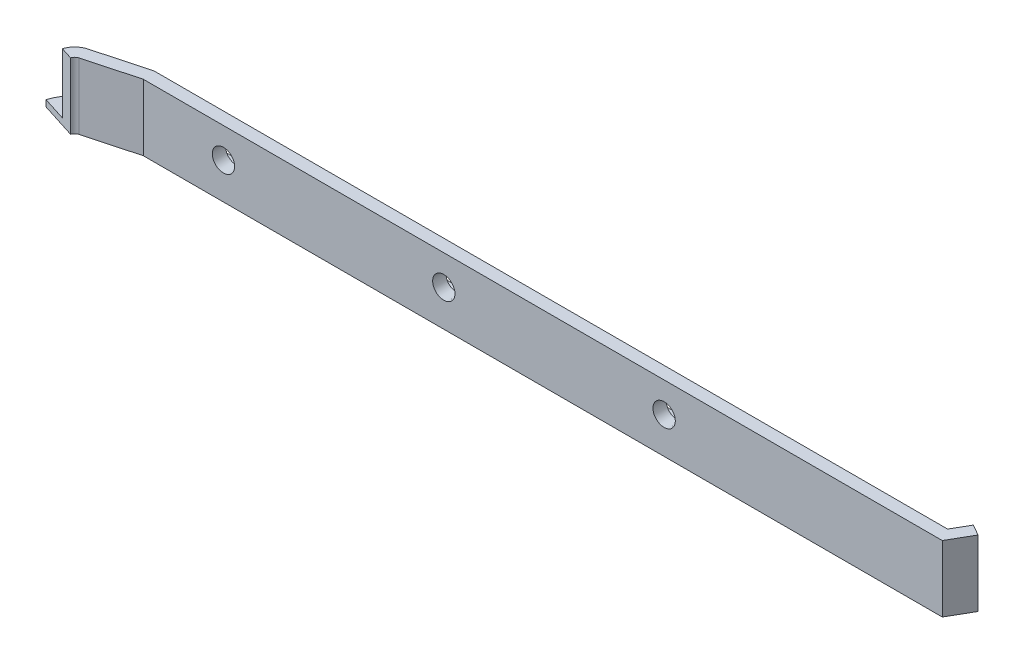
ISO-10303-21;
HEADER;
FILE_DESCRIPTION(('STEP AP214'),'2;1');
FILE_NAME('part.step','',(''),(''),'','','');
FILE_SCHEMA(('AUTOMOTIVE_DESIGN { 1 0 10303 214 1 1 1 1 }'));
ENDSEC;
DATA;
#1=APPLICATION_CONTEXT('core data for automotive mechanical design processes');
#2=APPLICATION_PROTOCOL_DEFINITION('international standard','automotive_design',2000,#1);
#3=PRODUCT_CONTEXT('',#1,'mechanical');
#4=PRODUCT('Part','Part','',(#3));
#5=PRODUCT_RELATED_PRODUCT_CATEGORY('part','',(#4));
#6=PRODUCT_DEFINITION_FORMATION('','',#4);
#7=PRODUCT_DEFINITION_CONTEXT('part definition',#1,'design');
#8=PRODUCT_DEFINITION('design','',#6,#7);
#9=PRODUCT_DEFINITION_SHAPE('','',#8);
#10=(LENGTH_UNIT() NAMED_UNIT(*) SI_UNIT(.MILLI.,.METRE.));
#11=(NAMED_UNIT(*) PLANE_ANGLE_UNIT() SI_UNIT($,.RADIAN.));
#12=(NAMED_UNIT(*) SI_UNIT($,.STERADIAN.) SOLID_ANGLE_UNIT());
#13=UNCERTAINTY_MEASURE_WITH_UNIT(LENGTH_MEASURE(1.E-05),#10,'distance_accuracy_value','');
#14=(GEOMETRIC_REPRESENTATION_CONTEXT(3) GLOBAL_UNCERTAINTY_ASSIGNED_CONTEXT((#13)) GLOBAL_UNIT_ASSIGNED_CONTEXT((#10,
#11,#12)) REPRESENTATION_CONTEXT('',''));
#15=CARTESIAN_POINT('',(0.,0.,0.));
#16=DIRECTION('',(0.,0.,1.));
#17=DIRECTION('',(1.,0.,0.));
#18=AXIS2_PLACEMENT_3D('',#15,#16,#17);
#19=CARTESIAN_POINT('',(64.9820508075689,144.581403772798,-1.59807621135331));
#20=DIRECTION('',(-0.5,0.,0.866025403784439));
#21=DIRECTION('',(0.866025403784439,0.,0.5));
#22=AXIS2_PLACEMENT_3D('',#19,#20,#21);
#23=PLANE('',#22);
#24=DIRECTION('',(0.,-1.,0.));
#25=VECTOR('',#24,1.);
#26=CARTESIAN_POINT('',(63.25,144.581403772798,-2.59807621135332));
#27=LINE('',#26,#25);
#28=CARTESIAN_POINT('',(63.25,4.7625,-2.59807621135332));
#29=VERTEX_POINT('',#28);
#30=CARTESIAN_POINT('',(63.25,-4.7625,-2.59807621135332));
#31=VERTEX_POINT('',#30);
#32=EDGE_CURVE('E255',#29,#31,#27,.T.);
#33=ORIENTED_EDGE('',*,*,#32,.F.);
#34=DIRECTION('',(0.866025403784439,0.,0.5));
#35=VECTOR('',#34,1.);
#36=CARTESIAN_POINT('',(64.9820508075689,4.7625,-1.59807621135331));
#37=LINE('',#36,#35);
#38=CARTESIAN_POINT('',(64.9820508075689,4.7625,-1.59807621135331));
#39=VERTEX_POINT('',#38);
#40=EDGE_CURVE('E37',#29,#39,#37,.T.);
#41=ORIENTED_EDGE('',*,*,#40,.T.);
#42=DIRECTION('',(0.,-1.,0.));
#43=VECTOR('',#42,1.);
#44=CARTESIAN_POINT('',(64.9820508075689,144.581403772798,-1.59807621135331));
#45=LINE('',#44,#43);
#46=CARTESIAN_POINT('',(64.9820508075689,-5.7625,-1.59807621135331));
#47=VERTEX_POINT('',#46);
#48=EDGE_CURVE('E168',#39,#47,#45,.T.);
#49=ORIENTED_EDGE('',*,*,#48,.T.);
#50=DIRECTION('',(-0.866025403784438,0.,-0.500000000000002));
#51=VECTOR('',#50,1.);
#52=CARTESIAN_POINT('',(64.9820508075689,-5.7625,-1.59807621135331));
#53=LINE('',#52,#51);
#54=CARTESIAN_POINT('',(59.7858983848623,-5.7625,-4.59807621135333));
#55=VERTEX_POINT('',#54);
#56=EDGE_CURVE('E145',#47,#55,#53,.T.);
#57=ORIENTED_EDGE('',*,*,#56,.T.);
#58=DIRECTION('',(0.,1.,0.));
#59=VECTOR('',#58,1.);
#60=CARTESIAN_POINT('',(59.7858983848623,-5.7625,-4.59807621135333));
#61=LINE('',#60,#59);
#62=CARTESIAN_POINT('',(59.7858983848623,-4.7625,-4.59807621135333));
#63=VERTEX_POINT('',#62);
#64=EDGE_CURVE('E156',#55,#63,#61,.T.);
#65=ORIENTED_EDGE('',*,*,#64,.T.);
#66=DIRECTION('',(-0.866025403784438,0.,-0.500000000000002));
#67=VECTOR('',#66,1.);
#68=CARTESIAN_POINT('',(64.9820508075689,-4.7625,-1.59807621135331));
#69=LINE('',#68,#67);
#70=EDGE_CURVE('E192',#31,#63,#69,.T.);
#71=ORIENTED_EDGE('',*,*,#70,.F.);
#72=EDGE_LOOP('',(#33,#41,#49,#57,#65,#71));
#73=FACE_BOUND('',#72,.T.);
#74=ADVANCED_FACE('F33',(#73),#23,.F.);
#75=CARTESIAN_POINT('',(63.4820508075689,144.581403772798,0.999999999999998));
#76=DIRECTION('',(-0.866025403784437,0.,-0.500000000000003));
#77=DIRECTION('',(-0.500000000000003,0.,0.866025403784437));
#78=AXIS2_PLACEMENT_3D('',#75,#76,#77);
#79=PLANE('',#78);
#80=ORIENTED_EDGE('',*,*,#48,.F.);
#81=DIRECTION('',(-0.500000000000003,0.,0.866025403784437));
#82=VECTOR('',#81,1.);
#83=CARTESIAN_POINT('',(63.4820508075689,4.7625,0.999999999999998));
#84=LINE('',#83,#82);
#85=CARTESIAN_POINT('',(62.9047005383793,4.7625,2.));
#86=VERTEX_POINT('',#85);
#87=EDGE_CURVE('E228',#39,#86,#84,.T.);
#88=ORIENTED_EDGE('',*,*,#87,.T.);
#89=DIRECTION('',(0.,-1.,0.));
#90=VECTOR('',#89,1.);
#91=CARTESIAN_POINT('',(62.9047005383793,144.581403772798,2.));
#92=LINE('',#91,#90);
#93=CARTESIAN_POINT('',(62.9047005383793,-5.7625,2.));
#94=VERTEX_POINT('',#93);
#95=EDGE_CURVE('E271',#86,#94,#92,.T.);
#96=ORIENTED_EDGE('',*,*,#95,.T.);
#97=DIRECTION('',(0.500000000000003,0.,-0.866025403784437));
#98=VECTOR('',#97,1.);
#99=CARTESIAN_POINT('',(63.4820508075689,-5.7625,0.999999999999998));
#100=LINE('',#99,#98);
#101=EDGE_CURVE('E169',#94,#47,#100,.T.);
#102=ORIENTED_EDGE('',*,*,#101,.T.);
#103=EDGE_LOOP('',(#80,#88,#96,#102));
#104=FACE_BOUND('',#103,.T.);
#105=ADVANCED_FACE('F288',(#104),#79,.F.);
#106=CARTESIAN_POINT('',(61.75,144.581403772798,1.99999999999999));
#107=DIRECTION('',(0.,0.,-1.));
#108=DIRECTION('',(-1.,0.,0.));
#109=AXIS2_PLACEMENT_3D('',#106,#107,#108);
#110=PLANE('',#109);
#111=CARTESIAN_POINT('',(-51.275,0.,1.99999999999999));
#112=DIRECTION('',(0.,0.,-1.));
#113=DIRECTION('',(-1.,0.,0.));
#114=AXIS2_PLACEMENT_3D('',#111,#112,#113);
#115=CIRCLE('',#114,1.77232524030097);
#116=CARTESIAN_POINT('',(-53.047325240301,0.,1.99999999999999));
#117=VERTEX_POINT('',#116);
#118=EDGE_CURVE('E224',#117,#117,#115,.T.);
#119=ORIENTED_EDGE('',*,*,#118,.T.);
#120=EDGE_LOOP('',(#119));
#121=FACE_BOUND('',#120,.T.);
#122=CARTESIAN_POINT('',(-16.275,0.,1.99999999999999));
#123=DIRECTION('',(0.,0.,-1.));
#124=DIRECTION('',(-1.,0.,0.));
#125=AXIS2_PLACEMENT_3D('',#122,#123,#124);
#126=CIRCLE('',#125,1.77232524030097);
#127=CARTESIAN_POINT('',(-18.047325240301,0.,1.99999999999999));
#128=VERTEX_POINT('',#127);
#129=EDGE_CURVE('E221',#128,#128,#126,.T.);
#130=ORIENTED_EDGE('',*,*,#129,.T.);
#131=EDGE_LOOP('',(#130));
#132=FACE_BOUND('',#131,.T.);
#133=CARTESIAN_POINT('',(18.725,0.,1.99999999999999));
#134=DIRECTION('',(0.,0.,-1.));
#135=DIRECTION('',(-1.,0.,0.));
#136=AXIS2_PLACEMENT_3D('',#133,#134,#135);
#137=CIRCLE('',#136,1.77232524030097);
#138=CARTESIAN_POINT('',(16.952674759699,0.,1.99999999999999));
#139=VERTEX_POINT('',#138);
#140=EDGE_CURVE('E213',#139,#139,#137,.T.);
#141=ORIENTED_EDGE('',*,*,#140,.T.);
#142=EDGE_LOOP('',(#141));
#143=FACE_BOUND('',#142,.T.);
#144=ORIENTED_EDGE('',*,*,#95,.F.);
#145=DIRECTION('',(-1.,0.,0.));
#146=VECTOR('',#145,1.);
#147=CARTESIAN_POINT('',(61.75,4.7625,1.99999999999999));
#148=LINE('',#147,#146);
#149=CARTESIAN_POINT('',(-64.0100013253943,4.7625,1.99999999999999));
#150=VERTEX_POINT('',#149);
#151=EDGE_CURVE('E50',#86,#150,#148,.T.);
#152=ORIENTED_EDGE('',*,*,#151,.T.);
#153=DIRECTION('',(0.,-1.,0.));
#154=VECTOR('',#153,1.);
#155=CARTESIAN_POINT('',(-64.0100013253943,144.581403772798,1.99999999999999));
#156=LINE('',#155,#154);
#157=CARTESIAN_POINT('',(-64.0100013253943,-5.7625,1.99999999999999));
#158=VERTEX_POINT('',#157);
#159=EDGE_CURVE('E269',#150,#158,#156,.T.);
#160=ORIENTED_EDGE('',*,*,#159,.T.);
#161=DIRECTION('',(1.,0.,0.));
#162=VECTOR('',#161,1.);
#163=CARTESIAN_POINT('',(61.75,-5.7625,1.99999999999999));
#164=LINE('',#163,#162);
#165=EDGE_CURVE('E171',#158,#94,#164,.T.);
#166=ORIENTED_EDGE('',*,*,#165,.T.);
#167=EDGE_LOOP('',(#144,#152,#160,#166));
#168=FACE_BOUND('',#167,.T.);
#169=ADVANCED_FACE('F292',(#121,#132,#143,#168),#110,.F.);
#170=CARTESIAN_POINT('',(-63.7541467885134,144.581403772798,1.93098729464594));
#171=DIRECTION('',(-0.260426605743303,0.,-0.965493647322975));
#172=DIRECTION('',(-0.965493647322975,0.,0.260426605743303));
#173=AXIS2_PLACEMENT_3D('',#170,#171,#172);
#174=PLANE('',#173);
#175=ORIENTED_EDGE('',*,*,#159,.F.);
#176=DIRECTION('',(-0.965493647322975,0.,0.260426605743303));
#177=VECTOR('',#176,1.);
#178=CARTESIAN_POINT('',(-63.7541467885134,4.7625,1.93098729464594));
#179=LINE('',#178,#177);
#180=CARTESIAN_POINT('',(-72.0407336946451,4.7625,4.16616274830573));
#181=VERTEX_POINT('',#180);
#182=EDGE_CURVE('E55',#150,#181,#179,.T.);
#183=ORIENTED_EDGE('',*,*,#182,.T.);
#184=DIRECTION('',(0.,-1.,0.));
#185=VECTOR('',#184,1.);
#186=CARTESIAN_POINT('',(-72.0407336946451,144.581403772798,4.16616274830573));
#187=LINE('',#186,#185);
#188=CARTESIAN_POINT('',(-72.0407336946451,-5.7625,4.16616274830573));
#189=VERTEX_POINT('',#188);
#190=EDGE_CURVE('E267',#181,#189,#187,.T.);
#191=ORIENTED_EDGE('',*,*,#190,.T.);
#192=DIRECTION('',(0.965493647322975,0.,-0.260426605743303));
#193=VECTOR('',#192,1.);
#194=CARTESIAN_POINT('',(-63.7541467885134,-5.7625,1.93098729464594));
#195=LINE('',#194,#193);
#196=EDGE_CURVE('E176',#189,#158,#195,.T.);
#197=ORIENTED_EDGE('',*,*,#196,.T.);
#198=EDGE_LOOP('',(#175,#183,#191,#197));
#199=FACE_BOUND('',#198,.T.);
#200=ADVANCED_FACE('F294',(#199),#174,.F.);
#201=CARTESIAN_POINT('',(-71.7803070889018,144.581403772798,5.13165639562871));
#202=DIRECTION('',(0.,-1.,0.));
#203=DIRECTION('',(0.,0.,-1.));
#204=AXIS2_PLACEMENT_3D('',#201,#202,#203);
#205=CYLINDRICAL_SURFACE('',#204,1.00000000000001);
#206=ORIENTED_EDGE('',*,*,#190,.F.);
#207=CARTESIAN_POINT('',(-71.7803070889018,4.7625,5.13165639562871));
#208=DIRECTION('',(0.,-1.,0.));
#209=DIRECTION('',(0.,0.,-1.));
#210=AXIS2_PLACEMENT_3D('',#207,#208,#209);
#211=CIRCLE('',#210,1.00000000000001);
#212=CARTESIAN_POINT('',(-72.7333585018401,4.7625,4.82884786817893));
#213=VERTEX_POINT('',#212);
#214=EDGE_CURVE('E233',#181,#213,#211,.F.);
#215=ORIENTED_EDGE('',*,*,#214,.T.);
#216=DIRECTION('',(0.,-1.,0.));
#217=VECTOR('',#216,1.);
#218=CARTESIAN_POINT('',(-72.7333585018401,144.581403772798,4.82884786817893));
#219=LINE('',#218,#217);
#220=CARTESIAN_POINT('',(-72.7333585018401,-5.7625,4.82884786817893));
#221=VERTEX_POINT('',#220);
#222=EDGE_CURVE('E265',#213,#221,#219,.T.);
#223=ORIENTED_EDGE('',*,*,#222,.T.);
#224=CARTESIAN_POINT('',(-71.7803070889018,-5.7625,5.13165639562871));
#225=DIRECTION('',(0.,-1.,0.));
#226=DIRECTION('',(1.,0.,0.));
#227=AXIS2_PLACEMENT_3D('',#224,#225,#226);
#228=CIRCLE('',#227,1.00000000000001);
#229=EDGE_CURVE('E179',#221,#189,#228,.T.);
#230=ORIENTED_EDGE('',*,*,#229,.T.);
#231=EDGE_LOOP('',(#206,#215,#223,#230));
#232=FACE_BOUND('',#231,.T.);
#233=ADVANCED_FACE('F299',(#232),#205,.F.);
#234=CARTESIAN_POINT('',(-74.6394613277167,144.581403772798,4.22323081327939));
#235=DIRECTION('',(0.302808527449773,0.,-0.953051412938305));
#236=DIRECTION('',(-0.953051412938305,0.,-0.302808527449773));
#237=AXIS2_PLACEMENT_3D('',#234,#235,#236);
#238=PLANE('',#237);
#239=ORIENTED_EDGE('',*,*,#222,.F.);
#240=DIRECTION('',(-0.953051412938305,0.,-0.302808527449773));
#241=VECTOR('',#240,1.);
#242=CARTESIAN_POINT('',(-74.6394613277167,4.7625,4.22323081327939));
#243=LINE('',#242,#241);
#244=CARTESIAN_POINT('',(-74.6394613277167,4.7625,4.22323081327939));
#245=VERTEX_POINT('',#244);
#246=EDGE_CURVE('E236',#213,#245,#243,.T.);
#247=ORIENTED_EDGE('',*,*,#246,.T.);
#248=DIRECTION('',(0.,-1.,0.));
#249=VECTOR('',#248,1.);
#250=CARTESIAN_POINT('',(-74.6394613277167,144.581403772798,4.22323081327939));
#251=LINE('',#250,#249);
#252=CARTESIAN_POINT('',(-74.6394613277167,-4.7625,4.22323081327939));
#253=VERTEX_POINT('',#252);
#254=EDGE_CURVE('E263',#245,#253,#251,.T.);
#255=ORIENTED_EDGE('',*,*,#254,.T.);
#256=DIRECTION('',(0.953051412938305,0.,0.302808527449773));
#257=VECTOR('',#256,1.);
#258=CARTESIAN_POINT('',(-78.4516669794699,-4.7625,3.0119967034803));
#259=LINE('',#258,#257);
#260=CARTESIAN_POINT('',(-78.4516669794699,-4.7625,3.0119967034803));
#261=VERTEX_POINT('',#260);
#262=EDGE_CURVE('E194',#261,#253,#259,.T.);
#263=ORIENTED_EDGE('',*,*,#262,.F.);
#264=DIRECTION('',(0.,1.,0.));
#265=VECTOR('',#264,1.);
#266=CARTESIAN_POINT('',(-78.4516669794699,-5.7625,3.0119967034803));
#267=LINE('',#266,#265);
#268=CARTESIAN_POINT('',(-78.4516669794699,-5.7625,3.0119967034803));
#269=VERTEX_POINT('',#268);
#270=EDGE_CURVE('E163',#269,#261,#267,.T.);
#271=ORIENTED_EDGE('',*,*,#270,.F.);
#272=DIRECTION('',(0.953051412938305,0.,0.302808527449773));
#273=VECTOR('',#272,1.);
#274=CARTESIAN_POINT('',(-78.4516669794699,-5.7625,3.0119967034803));
#275=LINE('',#274,#273);
#276=EDGE_CURVE('E182',#269,#221,#275,.T.);
#277=ORIENTED_EDGE('',*,*,#276,.T.);
#278=EDGE_LOOP('',(#239,#247,#255,#263,#271,#277));
#279=FACE_BOUND('',#278,.T.);
#280=ADVANCED_FACE('F302',(#279),#238,.F.);
#281=CARTESIAN_POINT('',(-71.7803070889018,144.581403772798,5.13165639562871));
#282=DIRECTION('',(0.,-1.,0.));
#283=DIRECTION('',(0.,0.,-1.));
#284=AXIS2_PLACEMENT_3D('',#281,#282,#283);
#285=CYLINDRICAL_SURFACE('',#284,3.00000000000001);
#286=CARTESIAN_POINT('',(-71.7803070889018,4.7625,5.13165639562871));
#287=DIRECTION('',(0.,-1.,0.));
#288=DIRECTION('',(0.,0.,-1.));
#289=AXIS2_PLACEMENT_3D('',#286,#287,#288);
#290=CIRCLE('',#289,3.00000000000001);
#291=CARTESIAN_POINT('',(-72.5615869061317,4.7625,2.23517545365977));
#292=VERTEX_POINT('',#291);
#293=EDGE_CURVE('E239',#292,#245,#290,.F.);
#294=ORIENTED_EDGE('',*,*,#293,.F.);
#295=DIRECTION('',(0.,-1.,0.));
#296=VECTOR('',#295,1.);
#297=CARTESIAN_POINT('',(-72.5615869061317,144.581403772798,2.23517545365978));
#298=LINE('',#297,#296);
#299=CARTESIAN_POINT('',(-72.5615869061317,-4.7625,2.23517545365978));
#300=VERTEX_POINT('',#299);
#301=EDGE_CURVE('E261',#292,#300,#298,.T.);
#302=ORIENTED_EDGE('',*,*,#301,.T.);
#303=CARTESIAN_POINT('',(-71.7803070889018,-4.7625,5.13165639562871));
#304=DIRECTION('',(0.,-1.,0.));
#305=DIRECTION('',(0.,0.,-1.));
#306=AXIS2_PLACEMENT_3D('',#303,#304,#305);
#307=CIRCLE('',#306,3.00000000000001);
#308=EDGE_CURVE('E246',#253,#300,#307,.T.);
#309=ORIENTED_EDGE('',*,*,#308,.F.);
#310=ORIENTED_EDGE('',*,*,#254,.F.);
#311=EDGE_LOOP('',(#294,#302,#309,#310));
#312=FACE_BOUND('',#311,.T.);
#313=ADVANCED_FACE('F321',(#312),#285,.T.);
#314=CARTESIAN_POINT('',(-64.275,144.581403772798,0.));
#315=DIRECTION('',(-0.260426605743303,0.,-0.965493647322975));
#316=DIRECTION('',(-0.965493647322975,0.,0.260426605743303));
#317=AXIS2_PLACEMENT_3D('',#314,#315,#316);
#318=PLANE('',#317);
#319=DIRECTION('',(-0.965493647322975,0.,0.260426605743303));
#320=VECTOR('',#319,1.);
#321=CARTESIAN_POINT('',(-64.275,4.7625,0.));
#322=LINE('',#321,#320);
#323=CARTESIAN_POINT('',(-64.275,4.7625,0.));
#324=VERTEX_POINT('',#323);
#325=EDGE_CURVE('E241',#324,#292,#322,.T.);
#326=ORIENTED_EDGE('',*,*,#325,.F.);
#327=DIRECTION('',(0.,-1.,0.));
#328=VECTOR('',#327,1.);
#329=CARTESIAN_POINT('',(-64.275,144.581403772798,0.));
#330=LINE('',#329,#328);
#331=CARTESIAN_POINT('',(-64.275,-4.7625,0.));
#332=VERTEX_POINT('',#331);
#333=EDGE_CURVE('E259',#324,#332,#330,.T.);
#334=ORIENTED_EDGE('',*,*,#333,.T.);
#335=DIRECTION('',(0.965493647322975,0.,-0.260426605743303));
#336=VECTOR('',#335,1.);
#337=CARTESIAN_POINT('',(-64.275,-4.7625,0.));
#338=LINE('',#337,#336);
#339=EDGE_CURVE('E249',#300,#332,#338,.T.);
#340=ORIENTED_EDGE('',*,*,#339,.F.);
#341=ORIENTED_EDGE('',*,*,#301,.F.);
#342=EDGE_LOOP('',(#326,#334,#340,#341));
#343=FACE_BOUND('',#342,.T.);
#344=ADVANCED_FACE('F323',(#343),#318,.T.);
#345=CARTESIAN_POINT('',(61.75,144.581403772798,0.));
#346=DIRECTION('',(0.,0.,-1.));
#347=DIRECTION('',(-1.,0.,0.));
#348=AXIS2_PLACEMENT_3D('',#345,#346,#347);
#349=PLANE('',#348);
#350=CARTESIAN_POINT('',(-51.275,0.,0.));
#351=DIRECTION('',(0.,0.,-1.));
#352=DIRECTION('',(-1.,0.,0.));
#353=AXIS2_PLACEMENT_3D('',#350,#351,#352);
#354=CIRCLE('',#353,1.65);
#355=CARTESIAN_POINT('',(-52.925,0.,0.));
#356=VERTEX_POINT('',#355);
#357=EDGE_CURVE('E210',#356,#356,#354,.T.);
#358=ORIENTED_EDGE('',*,*,#357,.F.);
#359=EDGE_LOOP('',(#358));
#360=FACE_BOUND('',#359,.T.);
#361=CARTESIAN_POINT('',(-16.275,0.,0.));
#362=DIRECTION('',(0.,0.,-1.));
#363=DIRECTION('',(-1.,0.,0.));
#364=AXIS2_PLACEMENT_3D('',#361,#362,#363);
#365=CIRCLE('',#364,1.65);
#366=CARTESIAN_POINT('',(-17.925,0.,0.));
#367=VERTEX_POINT('',#366);
#368=EDGE_CURVE('E214',#367,#367,#365,.T.);
#369=ORIENTED_EDGE('',*,*,#368,.F.);
#370=EDGE_LOOP('',(#369));
#371=FACE_BOUND('',#370,.T.);
#372=CARTESIAN_POINT('',(18.725,0.,0.));
#373=DIRECTION('',(0.,0.,-1.));
#374=DIRECTION('',(-1.,0.,0.));
#375=AXIS2_PLACEMENT_3D('',#372,#373,#374);
#376=CIRCLE('',#375,1.65);
#377=CARTESIAN_POINT('',(17.075,0.,0.));
#378=VERTEX_POINT('',#377);
#379=EDGE_CURVE('E162',#378,#378,#376,.T.);
#380=ORIENTED_EDGE('',*,*,#379,.F.);
#381=EDGE_LOOP('',(#380));
#382=FACE_BOUND('',#381,.T.);
#383=DIRECTION('',(-1.,0.,0.));
#384=VECTOR('',#383,1.);
#385=CARTESIAN_POINT('',(61.75,4.7625,0.));
#386=LINE('',#385,#384);
#387=CARTESIAN_POINT('',(61.75,4.7625,0.));
#388=VERTEX_POINT('',#387);
#389=EDGE_CURVE('E42',#388,#324,#386,.T.);
#390=ORIENTED_EDGE('',*,*,#389,.F.);
#391=DIRECTION('',(0.,-1.,0.));
#392=VECTOR('',#391,1.);
#393=CARTESIAN_POINT('',(61.75,144.581403772798,0.));
#394=LINE('',#393,#392);
#395=CARTESIAN_POINT('',(61.75,-4.7625,0.));
#396=VERTEX_POINT('',#395);
#397=EDGE_CURVE('E256',#388,#396,#394,.T.);
#398=ORIENTED_EDGE('',*,*,#397,.T.);
#399=DIRECTION('',(1.,0.,0.));
#400=VECTOR('',#399,1.);
#401=CARTESIAN_POINT('',(61.75,-4.7625,0.));
#402=LINE('',#401,#400);
#403=EDGE_CURVE('E252',#332,#396,#402,.T.);
#404=ORIENTED_EDGE('',*,*,#403,.F.);
#405=ORIENTED_EDGE('',*,*,#333,.F.);
#406=EDGE_LOOP('',(#390,#398,#404,#405));
#407=FACE_BOUND('',#406,.T.);
#408=ADVANCED_FACE('F283',(#360,#371,#382,#407),#349,.T.);
#409=CARTESIAN_POINT('',(61.75,144.581403772798,0.));
#410=DIRECTION('',(-0.866025403784437,0.,-0.500000000000003));
#411=DIRECTION('',(-0.500000000000003,0.,0.866025403784437));
#412=AXIS2_PLACEMENT_3D('',#409,#410,#411);
#413=PLANE('',#412);
#414=DIRECTION('',(-0.500000000000003,0.,0.866025403784437));
#415=VECTOR('',#414,1.);
#416=CARTESIAN_POINT('',(61.75,4.7625,0.));
#417=LINE('',#416,#415);
#418=EDGE_CURVE('E11',#29,#388,#417,.T.);
#419=ORIENTED_EDGE('',*,*,#418,.F.);
#420=ORIENTED_EDGE('',*,*,#32,.T.);
#421=DIRECTION('',(0.500000000000003,0.,-0.866025403784437));
#422=VECTOR('',#421,1.);
#423=CARTESIAN_POINT('',(61.75,-4.7625,0.));
#424=LINE('',#423,#422);
#425=EDGE_CURVE('E227',#396,#31,#424,.T.);
#426=ORIENTED_EDGE('',*,*,#425,.F.);
#427=ORIENTED_EDGE('',*,*,#397,.F.);
#428=EDGE_LOOP('',(#419,#420,#426,#427));
#429=FACE_BOUND('',#428,.T.);
#430=ADVANCED_FACE('F35',(#429),#413,.T.);
#431=CARTESIAN_POINT('',(-97.775,4.7625,-6.5));
#432=DIRECTION('',(0.,-1.,0.));
#433=DIRECTION('',(1.,0.,0.));
#434=AXIS2_PLACEMENT_3D('',#431,#432,#433);
#435=PLANE('',#434);
#436=ORIENTED_EDGE('',*,*,#418,.T.);
#437=ORIENTED_EDGE('',*,*,#389,.T.);
#438=ORIENTED_EDGE('',*,*,#325,.T.);
#439=ORIENTED_EDGE('',*,*,#293,.T.);
#440=ORIENTED_EDGE('',*,*,#246,.F.);
#441=ORIENTED_EDGE('',*,*,#214,.F.);
#442=ORIENTED_EDGE('',*,*,#182,.F.);
#443=ORIENTED_EDGE('',*,*,#151,.F.);
#444=ORIENTED_EDGE('',*,*,#87,.F.);
#445=ORIENTED_EDGE('',*,*,#40,.F.);
#446=EDGE_LOOP('',(#436,#437,#438,#439,#440,#441,#442,#443,#444,#445));
#447=FACE_BOUND('',#446,.T.);
#448=ADVANCED_FACE('F285',(#447),#435,.F.);
#449=CARTESIAN_POINT('',(18.725,0.,0.));
#450=DIRECTION('',(0.,0.,1.));
#451=DIRECTION('',(-1.,0.,0.));
#452=AXIS2_PLACEMENT_3D('',#449,#450,#451);
#453=CONICAL_SURFACE('',#452,1.65,0.0610865238198017);
#454=ORIENTED_EDGE('',*,*,#379,.T.);
#455=EDGE_LOOP('',(#454));
#456=FACE_BOUND('',#455,.T.);
#457=ORIENTED_EDGE('',*,*,#140,.F.);
#458=EDGE_LOOP('',(#457));
#459=FACE_BOUND('',#458,.T.);
#460=ADVANCED_FACE('F435',(#456,#459),#453,.F.);
#461=CARTESIAN_POINT('',(-16.275,0.,0.));
#462=DIRECTION('',(0.,0.,1.));
#463=DIRECTION('',(-1.,0.,0.));
#464=AXIS2_PLACEMENT_3D('',#461,#462,#463);
#465=CONICAL_SURFACE('',#464,1.65,0.0610865238198017);
#466=ORIENTED_EDGE('',*,*,#368,.T.);
#467=EDGE_LOOP('',(#466));
#468=FACE_BOUND('',#467,.T.);
#469=ORIENTED_EDGE('',*,*,#129,.F.);
#470=EDGE_LOOP('',(#469));
#471=FACE_BOUND('',#470,.T.);
#472=ADVANCED_FACE('F431',(#468,#471),#465,.F.);
#473=CARTESIAN_POINT('',(-51.275,0.,0.));
#474=DIRECTION('',(0.,0.,1.));
#475=DIRECTION('',(-1.,0.,0.));
#476=AXIS2_PLACEMENT_3D('',#473,#474,#475);
#477=CONICAL_SURFACE('',#476,1.65,0.0610865238198017);
#478=ORIENTED_EDGE('',*,*,#357,.T.);
#479=EDGE_LOOP('',(#478));
#480=FACE_BOUND('',#479,.T.);
#481=ORIENTED_EDGE('',*,*,#118,.F.);
#482=EDGE_LOOP('',(#481));
#483=FACE_BOUND('',#482,.T.);
#484=ADVANCED_FACE('F384',(#480,#483),#477,.F.);
#485=CARTESIAN_POINT('',(-71.7803070889018,-4.7625,5.13165639562871));
#486=DIRECTION('',(0.,-1.,0.));
#487=DIRECTION('',(1.,0.,0.));
#488=AXIS2_PLACEMENT_3D('',#485,#486,#487);
#489=PLANE('',#488);
#490=ORIENTED_EDGE('',*,*,#403,.T.);
#491=ORIENTED_EDGE('',*,*,#425,.T.);
#492=ORIENTED_EDGE('',*,*,#70,.T.);
#493=DIRECTION('',(0.500000000000003,0.,-0.866025403784437));
#494=VECTOR('',#493,1.);
#495=CARTESIAN_POINT('',(58.2858983848623,-4.7625,-2.00000000000002));
#496=LINE('',#495,#494);
#497=CARTESIAN_POINT('',(59.4405989232415,-4.7625,-4.00000000000001));
#498=VERTEX_POINT('',#497);
#499=EDGE_CURVE('E159',#498,#63,#496,.T.);
#500=ORIENTED_EDGE('',*,*,#499,.F.);
#501=DIRECTION('',(1.,0.,0.));
#502=VECTOR('',#501,1.);
#503=CARTESIAN_POINT('',(61.75,-4.7625,-4.00000000000001));
#504=LINE('',#503,#502);
#505=CARTESIAN_POINT('',(-64.8049973492115,-4.7625,-4.00000000000001));
#506=VERTEX_POINT('',#505);
#507=EDGE_CURVE('E152',#506,#498,#504,.T.);
#508=ORIENTED_EDGE('',*,*,#507,.F.);
#509=DIRECTION('',(0.965493647322975,0.,-0.260426605743303));
#510=VECTOR('',#509,1.);
#511=CARTESIAN_POINT('',(-65.3167064229732,-4.7625,-3.86197458929191));
#512=LINE('',#511,#510);
#513=CARTESIAN_POINT('',(-73.6032933291049,-4.7625,-1.62679913563212));
#514=VERTEX_POINT('',#513);
#515=EDGE_CURVE('E199',#514,#506,#512,.T.);
#516=ORIENTED_EDGE('',*,*,#515,.F.);
#517=CARTESIAN_POINT('',(-71.7803070889018,-4.7625,5.13165639562871));
#518=DIRECTION('',(0.,-1.,0.));
#519=DIRECTION('',(1.,0.,0.));
#520=AXIS2_PLACEMENT_3D('',#517,#518,#519);
#521=CIRCLE('',#520,7.00000000000001);
#522=EDGE_CURVE('E197',#261,#514,#521,.T.);
#523=ORIENTED_EDGE('',*,*,#522,.F.);
#524=ORIENTED_EDGE('',*,*,#262,.T.);
#525=ORIENTED_EDGE('',*,*,#308,.T.);
#526=ORIENTED_EDGE('',*,*,#339,.T.);
#527=EDGE_LOOP('',(#490,#491,#492,#500,#508,#516,#523,#524,#525,#526));
#528=FACE_BOUND('',#527,.T.);
#529=ADVANCED_FACE('F277',(#528),#489,.F.);
#530=CARTESIAN_POINT('',(58.2858983848623,-5.7625,-2.00000000000002));
#531=DIRECTION('',(0.866025403784437,0.,0.500000000000003));
#532=DIRECTION('',(0.500000000000003,0.,-0.866025403784437));
#533=AXIS2_PLACEMENT_3D('',#530,#531,#532);
#534=PLANE('',#533);
#535=ORIENTED_EDGE('',*,*,#499,.T.);
#536=ORIENTED_EDGE('',*,*,#64,.F.);
#537=DIRECTION('',(0.500000000000003,0.,-0.866025403784437));
#538=VECTOR('',#537,1.);
#539=CARTESIAN_POINT('',(58.2858983848623,-5.7625,-2.00000000000002));
#540=LINE('',#539,#538);
#541=CARTESIAN_POINT('',(59.4405989232415,-5.7625,-4.00000000000001));
#542=VERTEX_POINT('',#541);
#543=EDGE_CURVE('E140',#542,#55,#540,.T.);
#544=ORIENTED_EDGE('',*,*,#543,.F.);
#545=DIRECTION('',(0.,1.,0.));
#546=VECTOR('',#545,1.);
#547=CARTESIAN_POINT('',(59.4405989232415,-5.7625,-4.00000000000001));
#548=LINE('',#547,#546);
#549=EDGE_CURVE('E190',#542,#498,#548,.T.);
#550=ORIENTED_EDGE('',*,*,#549,.T.);
#551=EDGE_LOOP('',(#535,#536,#544,#550));
#552=FACE_BOUND('',#551,.T.);
#553=ADVANCED_FACE('F157',(#552),#534,.F.);
#554=CARTESIAN_POINT('',(-71.7803070889018,-5.7625,5.13165639562871));
#555=DIRECTION('',(0.,1.,0.));
#556=DIRECTION('',(0.,0.,1.));
#557=AXIS2_PLACEMENT_3D('',#554,#555,#556);
#558=CYLINDRICAL_SURFACE('',#557,7.00000000000001);
#559=ORIENTED_EDGE('',*,*,#522,.T.);
#560=DIRECTION('',(0.,1.,0.));
#561=VECTOR('',#560,1.);
#562=CARTESIAN_POINT('',(-73.6032933291049,-5.7625,-1.62679913563212));
#563=LINE('',#562,#561);
#564=CARTESIAN_POINT('',(-73.6032933291049,-5.7625,-1.62679913563212));
#565=VERTEX_POINT('',#564);
#566=EDGE_CURVE('E206',#565,#514,#563,.T.);
#567=ORIENTED_EDGE('',*,*,#566,.F.);
#568=CARTESIAN_POINT('',(-71.7803070889018,-5.7625,5.13165639562871));
#569=DIRECTION('',(0.,-1.,0.));
#570=DIRECTION('',(1.,0.,0.));
#571=AXIS2_PLACEMENT_3D('',#568,#569,#570);
#572=CIRCLE('',#571,7.00000000000001);
#573=EDGE_CURVE('E185',#269,#565,#572,.T.);
#574=ORIENTED_EDGE('',*,*,#573,.F.);
#575=ORIENTED_EDGE('',*,*,#270,.T.);
#576=EDGE_LOOP('',(#559,#567,#574,#575));
#577=FACE_BOUND('',#576,.T.);
#578=ADVANCED_FACE('F309',(#577),#558,.T.);
#579=CARTESIAN_POINT('',(-65.3167064229732,-5.7625,-3.86197458929191));
#580=DIRECTION('',(0.260426605743303,0.,0.965493647322975));
#581=DIRECTION('',(0.965493647322975,0.,-0.260426605743303));
#582=AXIS2_PLACEMENT_3D('',#579,#580,#581);
#583=PLANE('',#582);
#584=ORIENTED_EDGE('',*,*,#515,.T.);
#585=DIRECTION('',(0.,1.,0.));
#586=VECTOR('',#585,1.);
#587=CARTESIAN_POINT('',(-64.8049973492115,-5.7625,-4.00000000000001));
#588=LINE('',#587,#586);
#589=CARTESIAN_POINT('',(-64.8049973492115,-5.7625,-4.00000000000001));
#590=VERTEX_POINT('',#589);
#591=EDGE_CURVE('E203',#590,#506,#588,.T.);
#592=ORIENTED_EDGE('',*,*,#591,.F.);
#593=DIRECTION('',(0.965493647322975,0.,-0.260426605743303));
#594=VECTOR('',#593,1.);
#595=CARTESIAN_POINT('',(-65.3167064229732,-5.7625,-3.86197458929191));
#596=LINE('',#595,#594);
#597=EDGE_CURVE('E187',#565,#590,#596,.T.);
#598=ORIENTED_EDGE('',*,*,#597,.F.);
#599=ORIENTED_EDGE('',*,*,#566,.T.);
#600=EDGE_LOOP('',(#584,#592,#598,#599));
#601=FACE_BOUND('',#600,.T.);
#602=ADVANCED_FACE('F313',(#601),#583,.F.);
#603=CARTESIAN_POINT('',(61.75,-5.7625,-4.00000000000001));
#604=DIRECTION('',(0.,0.,1.));
#605=DIRECTION('',(1.,0.,0.));
#606=AXIS2_PLACEMENT_3D('',#603,#604,#605);
#607=PLANE('',#606);
#608=ORIENTED_EDGE('',*,*,#507,.T.);
#609=ORIENTED_EDGE('',*,*,#549,.F.);
#610=DIRECTION('',(1.,0.,0.));
#611=VECTOR('',#610,1.);
#612=CARTESIAN_POINT('',(61.75,-5.7625,-4.00000000000001));
#613=LINE('',#612,#611);
#614=EDGE_CURVE('E148',#590,#542,#613,.T.);
#615=ORIENTED_EDGE('',*,*,#614,.F.);
#616=ORIENTED_EDGE('',*,*,#591,.T.);
#617=EDGE_LOOP('',(#608,#609,#615,#616));
#618=FACE_BOUND('',#617,.T.);
#619=ADVANCED_FACE('F316',(#618),#607,.F.);
#620=CARTESIAN_POINT('',(-71.7803070889018,-5.7625,5.13165639562871));
#621=DIRECTION('',(0.,-1.,0.));
#622=DIRECTION('',(1.,0.,0.));
#623=AXIS2_PLACEMENT_3D('',#620,#621,#622);
#624=PLANE('',#623);
#625=ORIENTED_EDGE('',*,*,#543,.T.);
#626=ORIENTED_EDGE('',*,*,#56,.F.);
#627=ORIENTED_EDGE('',*,*,#101,.F.);
#628=ORIENTED_EDGE('',*,*,#165,.F.);
#629=ORIENTED_EDGE('',*,*,#196,.F.);
#630=ORIENTED_EDGE('',*,*,#229,.F.);
#631=ORIENTED_EDGE('',*,*,#276,.F.);
#632=ORIENTED_EDGE('',*,*,#573,.T.);
#633=ORIENTED_EDGE('',*,*,#597,.T.);
#634=ORIENTED_EDGE('',*,*,#614,.T.);
#635=EDGE_LOOP('',(#625,#626,#627,#628,#629,#630,#631,#632,#633,#634));
#636=FACE_BOUND('',#635,.T.);
#637=ADVANCED_FACE('F142',(#636),#624,.T.);
#638=CLOSED_SHELL('',(#74,#105,#169,#200,#233,#280,#313,#344,#408,#430,#448,#460,#472,#484,#529,
#553,#578,#602,#619,#637));
#639=MANIFOLD_SOLID_BREP('B2',#638);
#640=ADVANCED_BREP_SHAPE_REPRESENTATION('',(#18,#639),#14);
#641=SHAPE_DEFINITION_REPRESENTATION(#9,#640);
ENDSEC;
END-ISO-10303-21;
